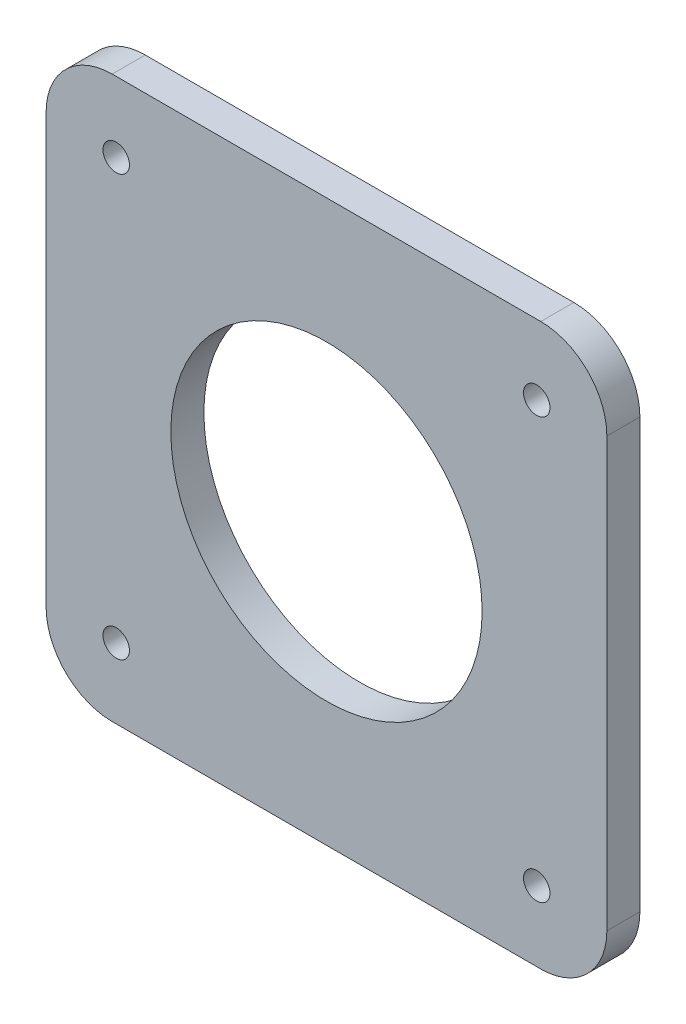
ISO-10303-21;
HEADER;
FILE_DESCRIPTION(('STEP AP214'),'2;1');
FILE_NAME('part.step','',(''),(''),'','','');
FILE_SCHEMA(('AUTOMOTIVE_DESIGN { 1 0 10303 214 1 1 1 1 }'));
ENDSEC;
DATA;
#1=APPLICATION_CONTEXT('core data for automotive mechanical design processes');
#2=APPLICATION_PROTOCOL_DEFINITION('international standard','automotive_design',2000,#1);
#3=PRODUCT_CONTEXT('',#1,'mechanical');
#4=PRODUCT('Part','Part','',(#3));
#5=PRODUCT_RELATED_PRODUCT_CATEGORY('part','',(#4));
#6=PRODUCT_DEFINITION_FORMATION('','',#4);
#7=PRODUCT_DEFINITION_CONTEXT('part definition',#1,'design');
#8=PRODUCT_DEFINITION('design','',#6,#7);
#9=PRODUCT_DEFINITION_SHAPE('','',#8);
#10=(LENGTH_UNIT() NAMED_UNIT(*) SI_UNIT(.MILLI.,.METRE.));
#11=(NAMED_UNIT(*) PLANE_ANGLE_UNIT() SI_UNIT($,.RADIAN.));
#12=(NAMED_UNIT(*) SI_UNIT($,.STERADIAN.) SOLID_ANGLE_UNIT());
#13=UNCERTAINTY_MEASURE_WITH_UNIT(LENGTH_MEASURE(1.E-05),#10,'distance_accuracy_value','');
#14=(GEOMETRIC_REPRESENTATION_CONTEXT(3) GLOBAL_UNCERTAINTY_ASSIGNED_CONTEXT((#13)) GLOBAL_UNIT_ASSIGNED_CONTEXT((#10,
#11,#12)) REPRESENTATION_CONTEXT('',''));
#15=CARTESIAN_POINT('',(0.,0.,0.));
#16=DIRECTION('',(0.,0.,1.));
#17=DIRECTION('',(1.,0.,0.));
#18=AXIS2_PLACEMENT_3D('',#15,#16,#17);
#19=CARTESIAN_POINT('',(59.3145246333828,55.4306557917285,5.));
#20=DIRECTION('',(0.,0.,-1.));
#21=DIRECTION('',(-1.,0.,0.));
#22=AXIS2_PLACEMENT_3D('',#19,#20,#21);
#23=PLANE('',#22);
#24=CARTESIAN_POINT('',(59.3145246333828,55.4306557917285,5.));
#25=DIRECTION('',(0.,0.,1.));
#26=DIRECTION('',(-1.,0.,0.));
#27=AXIS2_PLACEMENT_3D('',#24,#25,#26);
#28=CIRCLE('',#27,9.99999999999999);
#29=CARTESIAN_POINT('',(69.3145246333828,55.4306557917284,5.));
#30=VERTEX_POINT('',#29);
#31=CARTESIAN_POINT('',(59.3145246333827,65.4306557917285,5.));
#32=VERTEX_POINT('',#31);
#33=EDGE_CURVE('E144',#30,#32,#28,.T.);
#34=ORIENTED_EDGE('',*,*,#33,.T.);
#35=DIRECTION('',(-1.,0.,0.));
#36=VECTOR('',#35,1.);
#37=CARTESIAN_POINT('',(-5.53547536661714,65.4306557917285,5.));
#38=LINE('',#37,#36);
#39=CARTESIAN_POINT('',(-5.53547536661714,65.4306557917285,5.));
#40=VERTEX_POINT('',#39);
#41=EDGE_CURVE('E92',#32,#40,#38,.T.);
#42=ORIENTED_EDGE('',*,*,#41,.T.);
#43=CARTESIAN_POINT('',(-5.53547536661721,55.4306557917285,5.));
#44=DIRECTION('',(0.,0.,1.));
#45=DIRECTION('',(1.,0.,0.));
#46=AXIS2_PLACEMENT_3D('',#43,#44,#45);
#47=CIRCLE('',#46,10.);
#48=CARTESIAN_POINT('',(-15.5354753666172,55.4306557917284,5.));
#49=VERTEX_POINT('',#48);
#50=EDGE_CURVE('E159',#40,#49,#47,.T.);
#51=ORIENTED_EDGE('',*,*,#50,.T.);
#52=DIRECTION('',(0.,-1.,0.));
#53=VECTOR('',#52,1.);
#54=CARTESIAN_POINT('',(-15.5354753666172,55.4306557917284,5.));
#55=LINE('',#54,#53);
#56=CARTESIAN_POINT('',(-15.5354753666172,-9.41934420827146,5.));
#57=VERTEX_POINT('',#56);
#58=EDGE_CURVE('E172',#49,#57,#55,.T.);
#59=ORIENTED_EDGE('',*,*,#58,.T.);
#60=CARTESIAN_POINT('',(-5.5354753666172,-9.41934420827153,5.));
#61=DIRECTION('',(0.,0.,1.));
#62=DIRECTION('',(1.,0.,0.));
#63=AXIS2_PLACEMENT_3D('',#60,#61,#62);
#64=CIRCLE('',#63,10.);
#65=CARTESIAN_POINT('',(-5.53547536661713,-19.4193442082715,5.));
#66=VERTEX_POINT('',#65);
#67=EDGE_CURVE('E111',#57,#66,#64,.T.);
#68=ORIENTED_EDGE('',*,*,#67,.T.);
#69=DIRECTION('',(1.,0.,0.));
#70=VECTOR('',#69,1.);
#71=CARTESIAN_POINT('',(-5.53547536661713,-19.4193442082715,5.));
#72=LINE('',#71,#70);
#73=CARTESIAN_POINT('',(59.3145246333827,-19.4193442082715,5.));
#74=VERTEX_POINT('',#73);
#75=EDGE_CURVE('E105',#66,#74,#72,.T.);
#76=ORIENTED_EDGE('',*,*,#75,.T.);
#77=CARTESIAN_POINT('',(59.3145246333828,-9.41934420827153,5.));
#78=DIRECTION('',(0.,0.,1.));
#79=DIRECTION('',(1.,0.,0.));
#80=AXIS2_PLACEMENT_3D('',#77,#78,#79);
#81=CIRCLE('',#80,10.);
#82=CARTESIAN_POINT('',(69.3145246333828,-9.41934420827153,5.));
#83=VERTEX_POINT('',#82);
#84=EDGE_CURVE('E109',#74,#83,#81,.T.);
#85=ORIENTED_EDGE('',*,*,#84,.T.);
#86=DIRECTION('',(0.,1.,0.));
#87=VECTOR('',#86,1.);
#88=CARTESIAN_POINT('',(69.3145246333828,55.4306557917284,5.));
#89=LINE('',#88,#87);
#90=EDGE_CURVE('E49',#83,#30,#89,.T.);
#91=ORIENTED_EDGE('',*,*,#90,.T.);
#92=EDGE_LOOP('',(#34,#42,#51,#59,#68,#76,#85,#91));
#93=FACE_BOUND('',#92,.T.);
#94=CARTESIAN_POINT('',(26.8895246333828,23.0056557917285,5.));
#95=DIRECTION('',(0.,0.,1.));
#96=DIRECTION('',(1.,0.,0.));
#97=AXIS2_PLACEMENT_3D('',#94,#95,#96);
#98=CIRCLE('',#97,23.55);
#99=CARTESIAN_POINT('',(50.4395246333828,23.0056557917285,5.));
#100=VERTEX_POINT('',#99);
#101=EDGE_CURVE('E133',#100,#100,#98,.T.);
#102=ORIENTED_EDGE('',*,*,#101,.F.);
#103=EDGE_LOOP('',(#102));
#104=FACE_BOUND('',#103,.T.);
#105=CARTESIAN_POINT('',(-4.92547536661721,54.8206557917285,5.));
#106=DIRECTION('',(0.,0.,1.));
#107=DIRECTION('',(1.,0.,0.));
#108=AXIS2_PLACEMENT_3D('',#105,#106,#107);
#109=CIRCLE('',#108,2.);
#110=CARTESIAN_POINT('',(-2.92547536661721,54.8206557917285,5.));
#111=VERTEX_POINT('',#110);
#112=EDGE_CURVE('E181',#111,#111,#109,.T.);
#113=ORIENTED_EDGE('',*,*,#112,.F.);
#114=EDGE_LOOP('',(#113));
#115=FACE_BOUND('',#114,.T.);
#116=CARTESIAN_POINT('',(-4.92547536661721,-8.80934420827153,5.));
#117=DIRECTION('',(0.,0.,1.));
#118=DIRECTION('',(1.,0.,0.));
#119=AXIS2_PLACEMENT_3D('',#116,#117,#118);
#120=CIRCLE('',#119,2.);
#121=CARTESIAN_POINT('',(-2.92547536661721,-8.80934420827153,5.));
#122=VERTEX_POINT('',#121);
#123=EDGE_CURVE('E187',#122,#122,#120,.T.);
#124=ORIENTED_EDGE('',*,*,#123,.F.);
#125=EDGE_LOOP('',(#124));
#126=FACE_BOUND('',#125,.T.);
#127=CARTESIAN_POINT('',(58.7045246333828,54.8206557917285,5.));
#128=DIRECTION('',(0.,0.,1.));
#129=DIRECTION('',(1.,0.,0.));
#130=AXIS2_PLACEMENT_3D('',#127,#128,#129);
#131=CIRCLE('',#130,2.);
#132=CARTESIAN_POINT('',(60.7045246333828,54.8206557917285,5.));
#133=VERTEX_POINT('',#132);
#134=EDGE_CURVE('E193',#133,#133,#131,.T.);
#135=ORIENTED_EDGE('',*,*,#134,.F.);
#136=EDGE_LOOP('',(#135));
#137=FACE_BOUND('',#136,.T.);
#138=CARTESIAN_POINT('',(58.7045246333828,-8.80934420827153,5.));
#139=DIRECTION('',(0.,0.,1.));
#140=DIRECTION('',(1.,0.,0.));
#141=AXIS2_PLACEMENT_3D('',#138,#139,#140);
#142=CIRCLE('',#141,2.);
#143=CARTESIAN_POINT('',(60.7045246333828,-8.80934420827153,5.));
#144=VERTEX_POINT('',#143);
#145=EDGE_CURVE('E199',#144,#144,#142,.T.);
#146=ORIENTED_EDGE('',*,*,#145,.F.);
#147=EDGE_LOOP('',(#146));
#148=FACE_BOUND('',#147,.T.);
#149=ADVANCED_FACE('F32',(#93,#104,#115,#126,#137,#148),#23,.F.);
#150=CARTESIAN_POINT('',(59.3145246333828,55.4306557917285,0.));
#151=DIRECTION('',(0.,0.,-1.));
#152=DIRECTION('',(-1.,0.,0.));
#153=AXIS2_PLACEMENT_3D('',#150,#151,#152);
#154=PLANE('',#153);
#155=CARTESIAN_POINT('',(58.7045246333828,54.8206557917285,0.));
#156=DIRECTION('',(0.,0.,1.));
#157=DIRECTION('',(1.,0.,0.));
#158=AXIS2_PLACEMENT_3D('',#155,#156,#157);
#159=CIRCLE('',#158,2.);
#160=CARTESIAN_POINT('',(60.7045246333828,54.8206557917285,0.));
#161=VERTEX_POINT('',#160);
#162=EDGE_CURVE('E196',#161,#161,#159,.T.);
#163=ORIENTED_EDGE('',*,*,#162,.T.);
#164=EDGE_LOOP('',(#163));
#165=FACE_BOUND('',#164,.T.);
#166=CARTESIAN_POINT('',(-4.92547536661721,54.8206557917285,0.));
#167=DIRECTION('',(0.,0.,1.));
#168=DIRECTION('',(1.,0.,0.));
#169=AXIS2_PLACEMENT_3D('',#166,#167,#168);
#170=CIRCLE('',#169,2.);
#171=CARTESIAN_POINT('',(-2.92547536661721,54.8206557917285,0.));
#172=VERTEX_POINT('',#171);
#173=EDGE_CURVE('E184',#172,#172,#170,.T.);
#174=ORIENTED_EDGE('',*,*,#173,.T.);
#175=EDGE_LOOP('',(#174));
#176=FACE_BOUND('',#175,.T.);
#177=CARTESIAN_POINT('',(59.3145246333828,55.4306557917285,0.));
#178=DIRECTION('',(0.,0.,1.));
#179=DIRECTION('',(-1.,0.,0.));
#180=AXIS2_PLACEMENT_3D('',#177,#178,#179);
#181=CIRCLE('',#180,9.99999999999999);
#182=CARTESIAN_POINT('',(69.3145246333828,55.4306557917284,0.));
#183=VERTEX_POINT('',#182);
#184=CARTESIAN_POINT('',(59.3145246333827,65.4306557917285,0.));
#185=VERTEX_POINT('',#184);
#186=EDGE_CURVE('E129',#183,#185,#181,.T.);
#187=ORIENTED_EDGE('',*,*,#186,.F.);
#188=DIRECTION('',(0.,1.,0.));
#189=VECTOR('',#188,1.);
#190=CARTESIAN_POINT('',(69.3145246333828,55.4306557917284,0.));
#191=LINE('',#190,#189);
#192=CARTESIAN_POINT('',(69.3145246333828,-9.41934420827153,0.));
#193=VERTEX_POINT('',#192);
#194=EDGE_CURVE('E84',#193,#183,#191,.T.);
#195=ORIENTED_EDGE('',*,*,#194,.F.);
#196=CARTESIAN_POINT('',(59.3145246333828,-9.41934420827153,0.));
#197=DIRECTION('',(0.,0.,1.));
#198=DIRECTION('',(1.,0.,0.));
#199=AXIS2_PLACEMENT_3D('',#196,#197,#198);
#200=CIRCLE('',#199,10.);
#201=CARTESIAN_POINT('',(59.3145246333827,-19.4193442082715,0.));
#202=VERTEX_POINT('',#201);
#203=EDGE_CURVE('E78',#202,#193,#200,.T.);
#204=ORIENTED_EDGE('',*,*,#203,.F.);
#205=DIRECTION('',(1.,0.,0.));
#206=VECTOR('',#205,1.);
#207=CARTESIAN_POINT('',(-5.53547536661713,-19.4193442082715,0.));
#208=LINE('',#207,#206);
#209=CARTESIAN_POINT('',(-5.53547536661713,-19.4193442082715,0.));
#210=VERTEX_POINT('',#209);
#211=EDGE_CURVE('E119',#210,#202,#208,.T.);
#212=ORIENTED_EDGE('',*,*,#211,.F.);
#213=CARTESIAN_POINT('',(-5.5354753666172,-9.41934420827153,0.));
#214=DIRECTION('',(0.,0.,1.));
#215=DIRECTION('',(1.,0.,0.));
#216=AXIS2_PLACEMENT_3D('',#213,#214,#215);
#217=CIRCLE('',#216,10.);
#218=CARTESIAN_POINT('',(-15.5354753666172,-9.41934420827146,0.));
#219=VERTEX_POINT('',#218);
#220=EDGE_CURVE('E139',#219,#210,#217,.T.);
#221=ORIENTED_EDGE('',*,*,#220,.F.);
#222=DIRECTION('',(0.,-1.,0.));
#223=VECTOR('',#222,1.);
#224=CARTESIAN_POINT('',(-15.5354753666172,55.4306557917284,0.));
#225=LINE('',#224,#223);
#226=CARTESIAN_POINT('',(-15.5354753666172,55.4306557917284,0.));
#227=VERTEX_POINT('',#226);
#228=EDGE_CURVE('E137',#227,#219,#225,.T.);
#229=ORIENTED_EDGE('',*,*,#228,.F.);
#230=CARTESIAN_POINT('',(-5.53547536661721,55.4306557917285,0.));
#231=DIRECTION('',(0.,0.,1.));
#232=DIRECTION('',(1.,0.,0.));
#233=AXIS2_PLACEMENT_3D('',#230,#231,#232);
#234=CIRCLE('',#233,10.);
#235=CARTESIAN_POINT('',(-5.53547536661714,65.4306557917285,0.));
#236=VERTEX_POINT('',#235);
#237=EDGE_CURVE('E135',#236,#227,#234,.T.);
#238=ORIENTED_EDGE('',*,*,#237,.F.);
#239=DIRECTION('',(-1.,0.,0.));
#240=VECTOR('',#239,1.);
#241=CARTESIAN_POINT('',(-5.53547536661714,65.4306557917285,0.));
#242=LINE('',#241,#240);
#243=EDGE_CURVE('E132',#185,#236,#242,.T.);
#244=ORIENTED_EDGE('',*,*,#243,.F.);
#245=EDGE_LOOP('',(#187,#195,#204,#212,#221,#229,#238,#244));
#246=FACE_BOUND('',#245,.T.);
#247=CARTESIAN_POINT('',(26.8895246333828,23.0056557917285,0.));
#248=DIRECTION('',(0.,0.,1.));
#249=DIRECTION('',(1.,0.,0.));
#250=AXIS2_PLACEMENT_3D('',#247,#248,#249);
#251=CIRCLE('',#250,23.55);
#252=CARTESIAN_POINT('',(50.4395246333828,23.0056557917285,0.));
#253=VERTEX_POINT('',#252);
#254=EDGE_CURVE('E178',#253,#253,#251,.T.);
#255=ORIENTED_EDGE('',*,*,#254,.T.);
#256=EDGE_LOOP('',(#255));
#257=FACE_BOUND('',#256,.T.);
#258=CARTESIAN_POINT('',(-4.92547536661721,-8.80934420827153,0.));
#259=DIRECTION('',(0.,0.,1.));
#260=DIRECTION('',(1.,0.,0.));
#261=AXIS2_PLACEMENT_3D('',#258,#259,#260);
#262=CIRCLE('',#261,2.);
#263=CARTESIAN_POINT('',(-2.92547536661721,-8.80934420827153,0.));
#264=VERTEX_POINT('',#263);
#265=EDGE_CURVE('E190',#264,#264,#262,.T.);
#266=ORIENTED_EDGE('',*,*,#265,.T.);
#267=EDGE_LOOP('',(#266));
#268=FACE_BOUND('',#267,.T.);
#269=CARTESIAN_POINT('',(58.7045246333828,-8.80934420827153,0.));
#270=DIRECTION('',(0.,0.,1.));
#271=DIRECTION('',(1.,0.,0.));
#272=AXIS2_PLACEMENT_3D('',#269,#270,#271);
#273=CIRCLE('',#272,2.);
#274=CARTESIAN_POINT('',(60.7045246333828,-8.80934420827153,0.));
#275=VERTEX_POINT('',#274);
#276=EDGE_CURVE('E202',#275,#275,#273,.T.);
#277=ORIENTED_EDGE('',*,*,#276,.T.);
#278=EDGE_LOOP('',(#277));
#279=FACE_BOUND('',#278,.T.);
#280=ADVANCED_FACE('F163',(#165,#176,#246,#257,#268,#279),#154,.T.);
#281=CARTESIAN_POINT('',(59.3145246333828,55.4306557917285,5.));
#282=DIRECTION('',(0.,0.,-1.));
#283=DIRECTION('',(-1.,0.,0.));
#284=AXIS2_PLACEMENT_3D('',#281,#282,#283);
#285=CYLINDRICAL_SURFACE('',#284,9.99999999999999);
#286=ORIENTED_EDGE('',*,*,#186,.T.);
#287=DIRECTION('',(0.,0.,-1.));
#288=VECTOR('',#287,1.);
#289=CARTESIAN_POINT('',(59.3145246333827,65.4306557917285,5.));
#290=LINE('',#289,#288);
#291=EDGE_CURVE('E11',#32,#185,#290,.T.);
#292=ORIENTED_EDGE('',*,*,#291,.F.);
#293=ORIENTED_EDGE('',*,*,#33,.F.);
#294=DIRECTION('',(0.,0.,-1.));
#295=VECTOR('',#294,1.);
#296=CARTESIAN_POINT('',(69.3145246333828,55.4306557917284,5.));
#297=LINE('',#296,#295);
#298=EDGE_CURVE('E125',#30,#183,#297,.T.);
#299=ORIENTED_EDGE('',*,*,#298,.T.);
#300=EDGE_LOOP('',(#286,#292,#293,#299));
#301=FACE_BOUND('',#300,.T.);
#302=ADVANCED_FACE('F34',(#301),#285,.T.);
#303=CARTESIAN_POINT('',(-5.53547536661714,65.4306557917285,5.));
#304=DIRECTION('',(0.,-1.,0.));
#305=DIRECTION('',(0.,0.,-1.));
#306=AXIS2_PLACEMENT_3D('',#303,#304,#305);
#307=PLANE('',#306);
#308=ORIENTED_EDGE('',*,*,#243,.T.);
#309=DIRECTION('',(0.,0.,-1.));
#310=VECTOR('',#309,1.);
#311=CARTESIAN_POINT('',(-5.53547536661714,65.4306557917285,5.));
#312=LINE('',#311,#310);
#313=EDGE_CURVE('E41',#40,#236,#312,.T.);
#314=ORIENTED_EDGE('',*,*,#313,.F.);
#315=ORIENTED_EDGE('',*,*,#41,.F.);
#316=ORIENTED_EDGE('',*,*,#291,.T.);
#317=EDGE_LOOP('',(#308,#314,#315,#316));
#318=FACE_BOUND('',#317,.T.);
#319=ADVANCED_FACE('F234',(#318),#307,.F.);
#320=CARTESIAN_POINT('',(-5.53547536661721,55.4306557917285,5.));
#321=DIRECTION('',(0.,0.,-1.));
#322=DIRECTION('',(-1.,0.,0.));
#323=AXIS2_PLACEMENT_3D('',#320,#321,#322);
#324=CYLINDRICAL_SURFACE('',#323,10.);
#325=ORIENTED_EDGE('',*,*,#237,.T.);
#326=DIRECTION('',(0.,0.,-1.));
#327=VECTOR('',#326,1.);
#328=CARTESIAN_POINT('',(-15.5354753666172,55.4306557917284,5.));
#329=LINE('',#328,#327);
#330=EDGE_CURVE('E151',#49,#227,#329,.T.);
#331=ORIENTED_EDGE('',*,*,#330,.F.);
#332=ORIENTED_EDGE('',*,*,#50,.F.);
#333=ORIENTED_EDGE('',*,*,#313,.T.);
#334=EDGE_LOOP('',(#325,#331,#332,#333));
#335=FACE_BOUND('',#334,.T.);
#336=ADVANCED_FACE('F157',(#335),#324,.T.);
#337=CARTESIAN_POINT('',(-15.5354753666172,55.4306557917284,5.));
#338=DIRECTION('',(1.,0.,0.));
#339=DIRECTION('',(0.,1.,0.));
#340=AXIS2_PLACEMENT_3D('',#337,#338,#339);
#341=PLANE('',#340);
#342=ORIENTED_EDGE('',*,*,#228,.T.);
#343=DIRECTION('',(0.,0.,-1.));
#344=VECTOR('',#343,1.);
#345=CARTESIAN_POINT('',(-15.5354753666172,-9.41934420827146,5.));
#346=LINE('',#345,#344);
#347=EDGE_CURVE('E148',#57,#219,#346,.T.);
#348=ORIENTED_EDGE('',*,*,#347,.F.);
#349=ORIENTED_EDGE('',*,*,#58,.F.);
#350=ORIENTED_EDGE('',*,*,#330,.T.);
#351=EDGE_LOOP('',(#342,#348,#349,#350));
#352=FACE_BOUND('',#351,.T.);
#353=ADVANCED_FACE('F168',(#352),#341,.F.);
#354=CARTESIAN_POINT('',(-5.5354753666172,-9.41934420827153,5.));
#355=DIRECTION('',(0.,0.,-1.));
#356=DIRECTION('',(-1.,0.,0.));
#357=AXIS2_PLACEMENT_3D('',#354,#355,#356);
#358=CYLINDRICAL_SURFACE('',#357,10.);
#359=ORIENTED_EDGE('',*,*,#220,.T.);
#360=DIRECTION('',(0.,0.,-1.));
#361=VECTOR('',#360,1.);
#362=CARTESIAN_POINT('',(-5.53547536661713,-19.4193442082715,5.));
#363=LINE('',#362,#361);
#364=EDGE_CURVE('E120',#66,#210,#363,.T.);
#365=ORIENTED_EDGE('',*,*,#364,.F.);
#366=ORIENTED_EDGE('',*,*,#67,.F.);
#367=ORIENTED_EDGE('',*,*,#347,.T.);
#368=EDGE_LOOP('',(#359,#365,#366,#367));
#369=FACE_BOUND('',#368,.T.);
#370=ADVANCED_FACE('F171',(#369),#358,.T.);
#371=CARTESIAN_POINT('',(-5.53547536661713,-19.4193442082715,5.));
#372=DIRECTION('',(0.,1.,0.));
#373=DIRECTION('',(0.,0.,1.));
#374=AXIS2_PLACEMENT_3D('',#371,#372,#373);
#375=PLANE('',#374);
#376=ORIENTED_EDGE('',*,*,#211,.T.);
#377=DIRECTION('',(0.,0.,-1.));
#378=VECTOR('',#377,1.);
#379=CARTESIAN_POINT('',(59.3145246333827,-19.4193442082715,5.));
#380=LINE('',#379,#378);
#381=EDGE_CURVE('E116',#74,#202,#380,.T.);
#382=ORIENTED_EDGE('',*,*,#381,.F.);
#383=ORIENTED_EDGE('',*,*,#75,.F.);
#384=ORIENTED_EDGE('',*,*,#364,.T.);
#385=EDGE_LOOP('',(#376,#382,#383,#384));
#386=FACE_BOUND('',#385,.T.);
#387=ADVANCED_FACE('F117',(#386),#375,.F.);
#388=CARTESIAN_POINT('',(59.3145246333828,-9.41934420827153,5.));
#389=DIRECTION('',(0.,0.,-1.));
#390=DIRECTION('',(-1.,0.,0.));
#391=AXIS2_PLACEMENT_3D('',#388,#389,#390);
#392=CYLINDRICAL_SURFACE('',#391,10.);
#393=ORIENTED_EDGE('',*,*,#203,.T.);
#394=DIRECTION('',(0.,0.,-1.));
#395=VECTOR('',#394,1.);
#396=CARTESIAN_POINT('',(69.3145246333828,-9.41934420827153,5.));
#397=LINE('',#396,#395);
#398=EDGE_CURVE('E121',#83,#193,#397,.T.);
#399=ORIENTED_EDGE('',*,*,#398,.F.);
#400=ORIENTED_EDGE('',*,*,#84,.F.);
#401=ORIENTED_EDGE('',*,*,#381,.T.);
#402=EDGE_LOOP('',(#393,#399,#400,#401));
#403=FACE_BOUND('',#402,.T.);
#404=ADVANCED_FACE('F123',(#403),#392,.T.);
#405=CARTESIAN_POINT('',(69.3145246333828,55.4306557917284,5.));
#406=DIRECTION('',(-1.,0.,0.));
#407=DIRECTION('',(0.,0.,1.));
#408=AXIS2_PLACEMENT_3D('',#405,#406,#407);
#409=PLANE('',#408);
#410=ORIENTED_EDGE('',*,*,#194,.T.);
#411=ORIENTED_EDGE('',*,*,#298,.F.);
#412=ORIENTED_EDGE('',*,*,#90,.F.);
#413=ORIENTED_EDGE('',*,*,#398,.T.);
#414=EDGE_LOOP('',(#410,#411,#412,#413));
#415=FACE_BOUND('',#414,.T.);
#416=ADVANCED_FACE('F222',(#415),#409,.F.);
#417=CARTESIAN_POINT('',(26.8895246333828,23.0056557917285,5.));
#418=DIRECTION('',(0.,0.,-1.));
#419=DIRECTION('',(-1.,0.,0.));
#420=AXIS2_PLACEMENT_3D('',#417,#418,#419);
#421=CYLINDRICAL_SURFACE('',#420,23.55);
#422=ORIENTED_EDGE('',*,*,#101,.T.);
#423=EDGE_LOOP('',(#422));
#424=FACE_BOUND('',#423,.T.);
#425=ORIENTED_EDGE('',*,*,#254,.F.);
#426=EDGE_LOOP('',(#425));
#427=FACE_BOUND('',#426,.T.);
#428=ADVANCED_FACE('F219',(#424,#427),#421,.F.);
#429=CARTESIAN_POINT('',(-4.92547536661721,54.8206557917285,5.));
#430=DIRECTION('',(0.,0.,-1.));
#431=DIRECTION('',(-1.,0.,0.));
#432=AXIS2_PLACEMENT_3D('',#429,#430,#431);
#433=CYLINDRICAL_SURFACE('',#432,2.);
#434=ORIENTED_EDGE('',*,*,#112,.T.);
#435=EDGE_LOOP('',(#434));
#436=FACE_BOUND('',#435,.T.);
#437=ORIENTED_EDGE('',*,*,#173,.F.);
#438=EDGE_LOOP('',(#437));
#439=FACE_BOUND('',#438,.T.);
#440=ADVANCED_FACE('F298',(#436,#439),#433,.F.);
#441=CARTESIAN_POINT('',(-4.92547536661721,-8.80934420827153,5.));
#442=DIRECTION('',(0.,0.,-1.));
#443=DIRECTION('',(-1.,0.,0.));
#444=AXIS2_PLACEMENT_3D('',#441,#442,#443);
#445=CYLINDRICAL_SURFACE('',#444,2.);
#446=ORIENTED_EDGE('',*,*,#123,.T.);
#447=EDGE_LOOP('',(#446));
#448=FACE_BOUND('',#447,.T.);
#449=ORIENTED_EDGE('',*,*,#265,.F.);
#450=EDGE_LOOP('',(#449));
#451=FACE_BOUND('',#450,.T.);
#452=ADVANCED_FACE('F306',(#448,#451),#445,.F.);
#453=CARTESIAN_POINT('',(58.7045246333828,54.8206557917285,5.));
#454=DIRECTION('',(0.,0.,-1.));
#455=DIRECTION('',(-1.,0.,0.));
#456=AXIS2_PLACEMENT_3D('',#453,#454,#455);
#457=CYLINDRICAL_SURFACE('',#456,2.);
#458=ORIENTED_EDGE('',*,*,#134,.T.);
#459=EDGE_LOOP('',(#458));
#460=FACE_BOUND('',#459,.T.);
#461=ORIENTED_EDGE('',*,*,#162,.F.);
#462=EDGE_LOOP('',(#461));
#463=FACE_BOUND('',#462,.T.);
#464=ADVANCED_FACE('F314',(#460,#463),#457,.F.);
#465=CARTESIAN_POINT('',(58.7045246333828,-8.80934420827153,5.));
#466=DIRECTION('',(0.,0.,-1.));
#467=DIRECTION('',(-1.,0.,0.));
#468=AXIS2_PLACEMENT_3D('',#465,#466,#467);
#469=CYLINDRICAL_SURFACE('',#468,2.);
#470=ORIENTED_EDGE('',*,*,#145,.T.);
#471=EDGE_LOOP('',(#470));
#472=FACE_BOUND('',#471,.T.);
#473=ORIENTED_EDGE('',*,*,#276,.F.);
#474=EDGE_LOOP('',(#473));
#475=FACE_BOUND('',#474,.T.);
#476=ADVANCED_FACE('F208',(#472,#475),#469,.F.);
#477=CLOSED_SHELL('',(#149,#280,#302,#319,#336,#353,#370,#387,#404,#416,#428,#440,#452,#464,#476));
#478=MANIFOLD_SOLID_BREP('B2',#477);
#479=ADVANCED_BREP_SHAPE_REPRESENTATION('',(#18,#478),#14);
#480=SHAPE_DEFINITION_REPRESENTATION(#9,#479);
ENDSEC;
END-ISO-10303-21;
